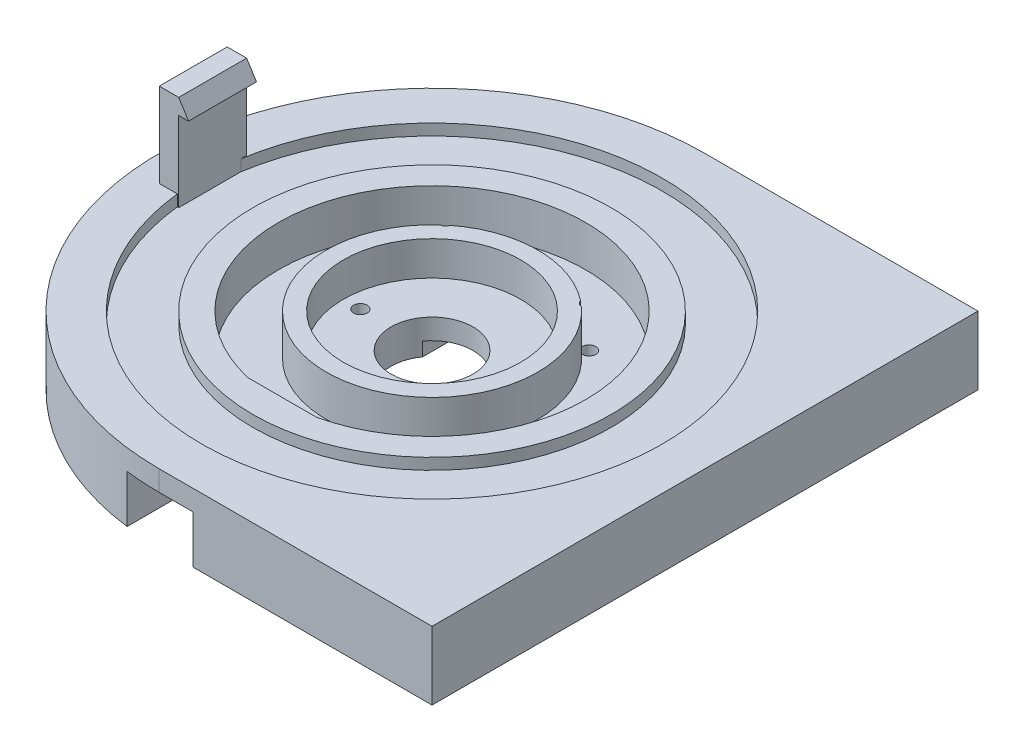
ISO-10303-21;
HEADER;
FILE_DESCRIPTION(('STEP AP214'),'2;1');
FILE_NAME('part.step','',(''),(''),'','','');
FILE_SCHEMA(('AUTOMOTIVE_DESIGN { 1 0 10303 214 1 1 1 1 }'));
ENDSEC;
DATA;
#1=APPLICATION_CONTEXT('core data for automotive mechanical design processes');
#2=APPLICATION_PROTOCOL_DEFINITION('international standard','automotive_design',2000,#1);
#3=PRODUCT_CONTEXT('',#1,'mechanical');
#4=PRODUCT('Part','Part','',(#3));
#5=PRODUCT_RELATED_PRODUCT_CATEGORY('part','',(#4));
#6=PRODUCT_DEFINITION_FORMATION('','',#4);
#7=PRODUCT_DEFINITION_CONTEXT('part definition',#1,'design');
#8=PRODUCT_DEFINITION('design','',#6,#7);
#9=PRODUCT_DEFINITION_SHAPE('','',#8);
#10=(LENGTH_UNIT() NAMED_UNIT(*) SI_UNIT(.MILLI.,.METRE.));
#11=(NAMED_UNIT(*) PLANE_ANGLE_UNIT() SI_UNIT($,.RADIAN.));
#12=(NAMED_UNIT(*) SI_UNIT($,.STERADIAN.) SOLID_ANGLE_UNIT());
#13=UNCERTAINTY_MEASURE_WITH_UNIT(LENGTH_MEASURE(1.E-05),#10,'distance_accuracy_value','');
#14=(GEOMETRIC_REPRESENTATION_CONTEXT(3) GLOBAL_UNCERTAINTY_ASSIGNED_CONTEXT((#13)) GLOBAL_UNIT_ASSIGNED_CONTEXT((#10,
#11,#12)) REPRESENTATION_CONTEXT('',''));
#15=CARTESIAN_POINT('',(0.,0.,0.));
#16=DIRECTION('',(0.,0.,1.));
#17=DIRECTION('',(1.,0.,0.));
#18=AXIS2_PLACEMENT_3D('',#15,#16,#17);
#19=CARTESIAN_POINT('',(0.,10.,0.));
#20=DIRECTION('',(0.,-1.,0.));
#21=DIRECTION('',(0.,0.,-1.));
#22=AXIS2_PLACEMENT_3D('',#19,#20,#21);
#23=PLANE('',#22);
#24=CARTESIAN_POINT('',(1.94458541445556,10.,-4.24128307319286));
#25=DIRECTION('',(0.,1.,0.));
#26=DIRECTION('',(0.,0.,1.));
#27=AXIS2_PLACEMENT_3D('',#24,#25,#26);
#28=CIRCLE('',#27,40.);
#29=CARTESIAN_POINT('',(1.94458541445556,10.,-44.2412830731929));
#30=VERTEX_POINT('',#29);
#31=CARTESIAN_POINT('',(1.94458541445556,10.,35.7587169268071));
#32=VERTEX_POINT('',#31);
#33=EDGE_CURVE('E256',#30,#32,#28,.T.);
#34=ORIENTED_EDGE('',*,*,#33,.T.);
#35=DIRECTION('',(1.,0.,0.));
#36=VECTOR('',#35,1.);
#37=CARTESIAN_POINT('',(-38.0554145855444,10.,35.7587169268071));
#38=LINE('',#37,#36);
#39=CARTESIAN_POINT('',(41.9445854144556,10.,35.7587169268071));
#40=VERTEX_POINT('',#39);
#41=EDGE_CURVE('E388',#32,#40,#38,.T.);
#42=ORIENTED_EDGE('',*,*,#41,.T.);
#43=DIRECTION('',(0.,0.,-1.));
#44=VECTOR('',#43,1.);
#45=CARTESIAN_POINT('',(41.9445854144556,10.,35.7587169268071));
#46=LINE('',#45,#44);
#47=CARTESIAN_POINT('',(41.9445854144556,10.,-44.2412830731929));
#48=VERTEX_POINT('',#47);
#49=EDGE_CURVE('E390',#40,#48,#46,.T.);
#50=ORIENTED_EDGE('',*,*,#49,.T.);
#51=DIRECTION('',(-1.,0.,0.));
#52=VECTOR('',#51,1.);
#53=CARTESIAN_POINT('',(-38.0554145855444,10.,-44.2412830731929));
#54=LINE('',#53,#52);
#55=EDGE_CURVE('E393',#48,#30,#54,.T.);
#56=ORIENTED_EDGE('',*,*,#55,.T.);
#57=EDGE_LOOP('',(#34,#42,#50,#56));
#58=FACE_BOUND('',#57,.T.);
#59=DIRECTION('',(1.,0.,0.));
#60=VECTOR('',#59,1.);
#61=CARTESIAN_POINT('',(0.,10.,-0.452703633644858));
#62=LINE('',#61,#60);
#63=CARTESIAN_POINT('',(-34.2364951699685,10.,-0.452703633644858));
#64=VERTEX_POINT('',#63);
#65=CARTESIAN_POINT('',(-31.5920984679773,10.,-0.452703633644858));
#66=VERTEX_POINT('',#65);
#67=EDGE_CURVE('E248',#64,#66,#62,.T.);
#68=ORIENTED_EDGE('',*,*,#67,.F.);
#69=DIRECTION('',(0.,0.,1.));
#70=VECTOR('',#69,1.);
#71=CARTESIAN_POINT('',(-34.2364951699685,10.,0.));
#72=LINE('',#71,#70);
#73=CARTESIAN_POINT('',(-34.2364951699685,10.,-10.4080430251595));
#74=VERTEX_POINT('',#73);
#75=EDGE_CURVE('E11',#74,#64,#72,.T.);
#76=ORIENTED_EDGE('',*,*,#75,.F.);
#77=DIRECTION('',(-1.,0.,0.));
#78=VECTOR('',#77,1.);
#79=CARTESIAN_POINT('',(0.,10.,-10.4080430251595));
#80=LINE('',#79,#78);
#81=CARTESIAN_POINT('',(-31.3854475420589,10.,-10.4080430251595));
#82=VERTEX_POINT('',#81);
#83=EDGE_CURVE('E41',#82,#74,#80,.T.);
#84=ORIENTED_EDGE('',*,*,#83,.F.);
#85=DIRECTION('',(0.,0.,-1.));
#86=VECTOR('',#85,1.);
#87=CARTESIAN_POINT('',(-31.3854475420589,10.,0.));
#88=LINE('',#87,#86);
#89=CARTESIAN_POINT('',(-31.3854475420589,10.,-9.54895705693214));
#90=VERTEX_POINT('',#89);
#91=EDGE_CURVE('E230',#90,#82,#88,.T.);
#92=ORIENTED_EDGE('',*,*,#91,.F.);
#93=CARTESIAN_POINT('',(1.94458541445557,10.,-4.24128307319287));
#94=DIRECTION('',(0.,1.,0.));
#95=DIRECTION('',(0.,0.,1.));
#96=AXIS2_PLACEMENT_3D('',#93,#94,#95);
#97=CIRCLE('',#96,33.75);
#98=EDGE_CURVE('E306',#66,#90,#97,.T.);
#99=ORIENTED_EDGE('',*,*,#98,.F.);
#100=EDGE_LOOP('',(#68,#76,#84,#92,#99));
#101=FACE_BOUND('',#100,.T.);
#102=ADVANCED_FACE('F33',(#58,#101),#23,.F.);
#103=CARTESIAN_POINT('',(1.94458541445557,8.35,-4.24128307319287));
#104=DIRECTION('',(0.,1.,0.));
#105=DIRECTION('',(0.,0.,1.));
#106=AXIS2_PLACEMENT_3D('',#103,#104,#105);
#107=CYLINDRICAL_SURFACE('',#106,33.75);
#108=DIRECTION('',(0.,1.,0.));
#109=VECTOR('',#108,1.);
#110=CARTESIAN_POINT('',(-31.5920984679773,8.35,-0.452703633644858));
#111=LINE('',#110,#109);
#112=CARTESIAN_POINT('',(-31.5920984679773,8.35,-0.452703633644858));
#113=VERTEX_POINT('',#112);
#114=EDGE_CURVE('E246',#66,#113,#111,.F.);
#115=ORIENTED_EDGE('',*,*,#114,.F.);
#116=ORIENTED_EDGE('',*,*,#98,.T.);
#117=DIRECTION('',(0.,1.,0.));
#118=VECTOR('',#117,1.);
#119=CARTESIAN_POINT('',(-31.3854475420589,8.35,-9.54895705693214));
#120=LINE('',#119,#118);
#121=CARTESIAN_POINT('',(-31.3854475420589,8.35,-9.54895705693214));
#122=VERTEX_POINT('',#121);
#123=EDGE_CURVE('E243',#122,#90,#120,.T.);
#124=ORIENTED_EDGE('',*,*,#123,.F.);
#125=CARTESIAN_POINT('',(1.94458541445557,8.35,-4.24128307319287));
#126=DIRECTION('',(0.,1.,0.));
#127=DIRECTION('',(0.,0.,1.));
#128=AXIS2_PLACEMENT_3D('',#125,#126,#127);
#129=CIRCLE('',#128,33.75);
#130=EDGE_CURVE('E309',#113,#122,#129,.T.);
#131=ORIENTED_EDGE('',*,*,#130,.F.);
#132=EDGE_LOOP('',(#115,#116,#124,#131));
#133=FACE_BOUND('',#132,.T.);
#134=ADVANCED_FACE('F451',(#133),#107,.F.);
#135=CARTESIAN_POINT('',(1.94458541445557,8.35,-4.24128307319287));
#136=DIRECTION('',(0.,1.,0.));
#137=DIRECTION('',(0.,0.,1.));
#138=AXIS2_PLACEMENT_3D('',#135,#136,#137);
#139=PLANE('',#138);
#140=CARTESIAN_POINT('',(1.94458541445557,8.35,-4.24128307319287));
#141=DIRECTION('',(0.,1.,0.));
#142=DIRECTION('',(0.,0.,1.));
#143=AXIS2_PLACEMENT_3D('',#140,#141,#142);
#144=CIRCLE('',#143,26.25);
#145=CARTESIAN_POINT('',(1.94458541445557,8.35,22.0087169268071));
#146=VERTEX_POINT('',#145);
#147=EDGE_CURVE('E303',#146,#146,#144,.T.);
#148=ORIENTED_EDGE('',*,*,#147,.F.);
#149=EDGE_LOOP('',(#148));
#150=FACE_BOUND('',#149,.T.);
#151=DIRECTION('',(0.,0.,-1.));
#152=VECTOR('',#151,1.);
#153=CARTESIAN_POINT('',(-31.3854475420589,8.35,-10.4080430251595));
#154=LINE('',#153,#152);
#155=CARTESIAN_POINT('',(-31.3854475420589,8.35,-0.452703633644858));
#156=VERTEX_POINT('',#155);
#157=EDGE_CURVE('E456',#156,#122,#154,.T.);
#158=ORIENTED_EDGE('',*,*,#157,.F.);
#159=DIRECTION('',(-1.,0.,0.));
#160=VECTOR('',#159,1.);
#161=CARTESIAN_POINT('',(1.94458541445557,8.35,-0.452703633644858));
#162=LINE('',#161,#160);
#163=EDGE_CURVE('E433',#156,#113,#162,.T.);
#164=ORIENTED_EDGE('',*,*,#163,.T.);
#165=ORIENTED_EDGE('',*,*,#130,.T.);
#166=EDGE_LOOP('',(#158,#164,#165));
#167=FACE_BOUND('',#166,.T.);
#168=ADVANCED_FACE('F455',(#150,#167),#139,.T.);
#169=CARTESIAN_POINT('',(0.,0.,0.));
#170=DIRECTION('',(0.,-1.,0.));
#171=DIRECTION('',(0.,0.,-1.));
#172=AXIS2_PLACEMENT_3D('',#169,#170,#171);
#173=PLANE('',#172);
#174=DIRECTION('',(0.,0.,-1.));
#175=VECTOR('',#174,1.);
#176=CARTESIAN_POINT('',(-2.93335983094335,0.,-18.6283350162171));
#177=LINE('',#176,#175);
#178=CARTESIAN_POINT('',(-2.93335983094335,0.,-7.73494164020971));
#179=VERTEX_POINT('',#178);
#180=CARTESIAN_POINT('',(-2.93335983094335,0.,-18.6283350162171));
#181=VERTEX_POINT('',#180);
#182=EDGE_CURVE('E264',#179,#181,#177,.T.);
#183=ORIENTED_EDGE('',*,*,#182,.F.);
#184=CARTESIAN_POINT('',(1.94458541445556,0.,-4.24128307319286));
#185=DIRECTION('',(0.,1.,0.));
#186=DIRECTION('',(0.,0.,1.));
#187=AXIS2_PLACEMENT_3D('',#184,#185,#186);
#188=CIRCLE('',#187,6.);
#189=CARTESIAN_POINT('',(6.86664016905719,0.,-7.67251856390221));
#190=VERTEX_POINT('',#189);
#191=EDGE_CURVE('E384',#179,#190,#188,.T.);
#192=ORIENTED_EDGE('',*,*,#191,.T.);
#193=DIRECTION('',(0.,0.,1.));
#194=VECTOR('',#193,1.);
#195=CARTESIAN_POINT('',(6.86664016905719,0.,-7.59099295485299));
#196=LINE('',#195,#194);
#197=CARTESIAN_POINT('',(6.86664016905719,0.,-18.6283350162171));
#198=VERTEX_POINT('',#197);
#199=EDGE_CURVE('E271',#198,#190,#196,.T.);
#200=ORIENTED_EDGE('',*,*,#199,.F.);
#201=DIRECTION('',(1.,0.,0.));
#202=VECTOR('',#201,1.);
#203=CARTESIAN_POINT('',(6.86664016905719,0.,-18.6283350162171));
#204=LINE('',#203,#202);
#205=EDGE_CURVE('E259',#181,#198,#204,.T.);
#206=ORIENTED_EDGE('',*,*,#205,.F.);
#207=EDGE_LOOP('',(#183,#192,#200,#206));
#208=FACE_BOUND('',#207,.T.);
#209=CARTESIAN_POINT('',(-8.55541458554444,0.,-4.24128307319286));
#210=DIRECTION('',(0.,-1.,0.));
#211=DIRECTION('',(0.,0.,1.));
#212=AXIS2_PLACEMENT_3D('',#209,#210,#211);
#213=CIRCLE('',#212,1.);
#214=CARTESIAN_POINT('',(-8.55541458554444,0.,-3.24128307319286));
#215=VERTEX_POINT('',#214);
#216=EDGE_CURVE('E277',#215,#215,#213,.T.);
#217=ORIENTED_EDGE('',*,*,#216,.F.);
#218=EDGE_LOOP('',(#217));
#219=FACE_BOUND('',#218,.T.);
#220=CARTESIAN_POINT('',(-8.55541458554444,0.,-16.7412830731929));
#221=DIRECTION('',(0.,-1.,0.));
#222=DIRECTION('',(0.,0.,1.));
#223=AXIS2_PLACEMENT_3D('',#220,#221,#222);
#224=CIRCLE('',#223,1.);
#225=CARTESIAN_POINT('',(-8.55541458554444,0.,-15.7412830731929));
#226=VERTEX_POINT('',#225);
#227=EDGE_CURVE('E286',#226,#226,#224,.T.);
#228=ORIENTED_EDGE('',*,*,#227,.F.);
#229=EDGE_LOOP('',(#228));
#230=FACE_BOUND('',#229,.T.);
#231=CARTESIAN_POINT('',(12.4445854144556,0.,-4.24128307319286));
#232=DIRECTION('',(0.,-1.,0.));
#233=DIRECTION('',(0.,0.,-1.));
#234=AXIS2_PLACEMENT_3D('',#231,#232,#233);
#235=CIRCLE('',#234,1.);
#236=CARTESIAN_POINT('',(12.4445854144556,0.,-5.24128307319286));
#237=VERTEX_POINT('',#236);
#238=EDGE_CURVE('E290',#237,#237,#235,.T.);
#239=ORIENTED_EDGE('',*,*,#238,.F.);
#240=EDGE_LOOP('',(#239));
#241=FACE_BOUND('',#240,.T.);
#242=CARTESIAN_POINT('',(12.4445854144556,0.,-16.7412830731929));
#243=DIRECTION('',(0.,-1.,0.));
#244=DIRECTION('',(0.,0.,-1.));
#245=AXIS2_PLACEMENT_3D('',#242,#243,#244);
#246=CIRCLE('',#245,1.);
#247=CARTESIAN_POINT('',(12.4445854144556,0.,-17.7412830731929));
#248=VERTEX_POINT('',#247);
#249=EDGE_CURVE('E298',#248,#248,#246,.T.);
#250=ORIENTED_EDGE('',*,*,#249,.F.);
#251=EDGE_LOOP('',(#250));
#252=FACE_BOUND('',#251,.T.);
#253=DIRECTION('',(0.,0.,-1.));
#254=VECTOR('',#253,1.);
#255=CARTESIAN_POINT('',(-3.05541458554445,0.,0.));
#256=LINE('',#255,#254);
#257=CARTESIAN_POINT('',(-3.05541458554445,0.,35.444986592776));
#258=VERTEX_POINT('',#257);
#259=CARTESIAN_POINT('',(-3.05541458554445,0.,26.7274224110473));
#260=VERTEX_POINT('',#259);
#261=EDGE_CURVE('E326',#258,#260,#256,.T.);
#262=ORIENTED_EDGE('',*,*,#261,.F.);
#263=CARTESIAN_POINT('',(1.94458541445556,0.,-4.24128307319286));
#264=DIRECTION('',(0.,-1.,0.));
#265=DIRECTION('',(0.,0.,-1.));
#266=AXIS2_PLACEMENT_3D('',#263,#264,#265);
#267=CIRCLE('',#266,40.);
#268=CARTESIAN_POINT('',(1.94458541445556,0.,-44.2412830731929));
#269=VERTEX_POINT('',#268);
#270=EDGE_CURVE('E429',#258,#269,#267,.T.);
#271=ORIENTED_EDGE('',*,*,#270,.T.);
#272=DIRECTION('',(-1.,0.,0.));
#273=VECTOR('',#272,1.);
#274=CARTESIAN_POINT('',(-38.0554145855444,0.,-44.2412830731929));
#275=LINE('',#274,#273);
#276=CARTESIAN_POINT('',(41.9445854144556,0.,-44.2412830731929));
#277=VERTEX_POINT('',#276);
#278=EDGE_CURVE('E391',#277,#269,#275,.T.);
#279=ORIENTED_EDGE('',*,*,#278,.F.);
#280=DIRECTION('',(0.,0.,-1.));
#281=VECTOR('',#280,1.);
#282=CARTESIAN_POINT('',(41.9445854144556,0.,35.7587169268071));
#283=LINE('',#282,#281);
#284=CARTESIAN_POINT('',(41.9445854144556,0.,35.7587169268071));
#285=VERTEX_POINT('',#284);
#286=EDGE_CURVE('E398',#285,#277,#283,.T.);
#287=ORIENTED_EDGE('',*,*,#286,.F.);
#288=DIRECTION('',(1.,0.,0.));
#289=VECTOR('',#288,1.);
#290=CARTESIAN_POINT('',(-38.0554145855444,0.,35.7587169268071));
#291=LINE('',#290,#289);
#292=CARTESIAN_POINT('',(6.94458541445556,0.,35.7587169268071));
#293=VERTEX_POINT('',#292);
#294=EDGE_CURVE('E387',#293,#285,#291,.T.);
#295=ORIENTED_EDGE('',*,*,#294,.F.);
#296=DIRECTION('',(0.,0.,1.));
#297=VECTOR('',#296,1.);
#298=CARTESIAN_POINT('',(6.94458541445556,0.,0.));
#299=LINE('',#298,#297);
#300=CARTESIAN_POINT('',(6.94458541445556,0.,26.7274224110473));
#301=VERTEX_POINT('',#300);
#302=EDGE_CURVE('E320',#301,#293,#299,.T.);
#303=ORIENTED_EDGE('',*,*,#302,.F.);
#304=DIRECTION('',(1.,0.,0.));
#305=VECTOR('',#304,1.);
#306=CARTESIAN_POINT('',(0.,0.,26.7274224110473));
#307=LINE('',#306,#305);
#308=EDGE_CURVE('E324',#260,#301,#307,.T.);
#309=ORIENTED_EDGE('',*,*,#308,.F.);
#310=EDGE_LOOP('',(#262,#271,#279,#287,#295,#303,#309));
#311=FACE_BOUND('',#310,.T.);
#312=ADVANCED_FACE('F542',(#208,#219,#230,#241,#252,#311),#173,.T.);
#313=CARTESIAN_POINT('',(-3.05541458554445,4.,0.));
#314=DIRECTION('',(1.,0.,0.));
#315=DIRECTION('',(0.,0.,-1.));
#316=AXIS2_PLACEMENT_3D('',#313,#314,#315);
#317=PLANE('',#316);
#318=DIRECTION('',(0.,0.,-1.));
#319=VECTOR('',#318,1.);
#320=CARTESIAN_POINT('',(-3.05541458554445,7.,35.7587169268071));
#321=LINE('',#320,#319);
#322=CARTESIAN_POINT('',(-3.05541458554444,7.,35.444986592776));
#323=VERTEX_POINT('',#322);
#324=CARTESIAN_POINT('',(-3.05541458554445,7.,17.6961278952874));
#325=VERTEX_POINT('',#324);
#326=EDGE_CURVE('E328',#323,#325,#321,.T.);
#327=ORIENTED_EDGE('',*,*,#326,.F.);
#328=DIRECTION('',(0.,1.,0.));
#329=VECTOR('',#328,1.);
#330=CARTESIAN_POINT('',(-3.05541458554445,-10.,35.444986592776));
#331=LINE('',#330,#329);
#332=EDGE_CURVE('E253',#323,#258,#331,.F.);
#333=ORIENTED_EDGE('',*,*,#332,.T.);
#334=ORIENTED_EDGE('',*,*,#261,.T.);
#335=DIRECTION('',(0.,1.,0.));
#336=VECTOR('',#335,1.);
#337=CARTESIAN_POINT('',(-3.05541458554445,-6.,26.7274224110473));
#338=LINE('',#337,#336);
#339=CARTESIAN_POINT('',(-3.05541458554445,4.,26.7274224110473));
#340=VERTEX_POINT('',#339);
#341=EDGE_CURVE('E318',#260,#340,#338,.T.);
#342=ORIENTED_EDGE('',*,*,#341,.T.);
#343=DIRECTION('',(0.,0.,-1.));
#344=VECTOR('',#343,1.);
#345=CARTESIAN_POINT('',(-3.05541458554445,4.,0.));
#346=LINE('',#345,#344);
#347=CARTESIAN_POINT('',(-3.05541458554445,4.,17.6961278952874));
#348=VERTEX_POINT('',#347);
#349=EDGE_CURVE('E350',#340,#348,#346,.T.);
#350=ORIENTED_EDGE('',*,*,#349,.T.);
#351=DIRECTION('',(0.,1.,0.));
#352=VECTOR('',#351,1.);
#353=CARTESIAN_POINT('',(-3.05541458554445,4.,17.6961278952874));
#354=LINE('',#353,#352);
#355=EDGE_CURVE('E357',#348,#325,#354,.T.);
#356=ORIENTED_EDGE('',*,*,#355,.T.);
#357=EDGE_LOOP('',(#327,#333,#334,#342,#350,#356));
#358=FACE_BOUND('',#357,.T.);
#359=ADVANCED_FACE('F545',(#358),#317,.T.);
#360=CARTESIAN_POINT('',(-38.0554145855444,10.,35.7587169268071));
#361=DIRECTION('',(0.,0.,-1.));
#362=DIRECTION('',(-1.,0.,0.));
#363=AXIS2_PLACEMENT_3D('',#360,#361,#362);
#364=PLANE('',#363);
#365=DIRECTION('',(0.,1.,0.));
#366=VECTOR('',#365,1.);
#367=CARTESIAN_POINT('',(1.94458541445556,-10.,35.7587169268071));
#368=LINE('',#367,#366);
#369=CARTESIAN_POINT('',(1.94458541445556,7.,35.7587169268071));
#370=VERTEX_POINT('',#369);
#371=EDGE_CURVE('E250',#370,#32,#368,.T.);
#372=ORIENTED_EDGE('',*,*,#371,.F.);
#373=DIRECTION('',(-1.,0.,0.));
#374=VECTOR('',#373,1.);
#375=CARTESIAN_POINT('',(9.94458541445556,7.,35.7587169268071));
#376=LINE('',#375,#374);
#377=CARTESIAN_POINT('',(6.94458541445556,7.,35.7587169268071));
#378=VERTEX_POINT('',#377);
#379=EDGE_CURVE('E338',#378,#370,#376,.T.);
#380=ORIENTED_EDGE('',*,*,#379,.F.);
#381=DIRECTION('',(0.,1.,0.));
#382=VECTOR('',#381,1.);
#383=CARTESIAN_POINT('',(6.94458541445556,4.,35.7587169268071));
#384=LINE('',#383,#382);
#385=EDGE_CURVE('E353',#293,#378,#384,.T.);
#386=ORIENTED_EDGE('',*,*,#385,.F.);
#387=ORIENTED_EDGE('',*,*,#294,.T.);
#388=DIRECTION('',(0.,-1.,0.));
#389=VECTOR('',#388,1.);
#390=CARTESIAN_POINT('',(41.9445854144556,10.,35.7587169268071));
#391=LINE('',#390,#389);
#392=EDGE_CURVE('E404',#40,#285,#391,.T.);
#393=ORIENTED_EDGE('',*,*,#392,.F.);
#394=ORIENTED_EDGE('',*,*,#41,.F.);
#395=EDGE_LOOP('',(#372,#380,#386,#387,#393,#394));
#396=FACE_BOUND('',#395,.T.);
#397=ADVANCED_FACE('F35',(#396),#364,.F.);
#398=CARTESIAN_POINT('',(9.94458541445556,7.,35.7587169268071));
#399=DIRECTION('',(0.,1.,0.));
#400=DIRECTION('',(0.,0.,1.));
#401=AXIS2_PLACEMENT_3D('',#398,#399,#400);
#402=PLANE('',#401);
#403=CARTESIAN_POINT('',(1.94458541445556,7.,-4.24128307319286));
#404=DIRECTION('',(0.,1.,0.));
#405=DIRECTION('',(0.,0.,1.));
#406=AXIS2_PLACEMENT_3D('',#403,#404,#405);
#407=CIRCLE('',#406,40.);
#408=EDGE_CURVE('E431',#323,#370,#407,.T.);
#409=ORIENTED_EDGE('',*,*,#408,.F.);
#410=ORIENTED_EDGE('',*,*,#326,.T.);
#411=DIRECTION('',(-1.,0.,0.));
#412=VECTOR('',#411,1.);
#413=CARTESIAN_POINT('',(9.94458541445556,7.,17.6961278952874));
#414=LINE('',#413,#412);
#415=CARTESIAN_POINT('',(6.94458541445557,7.,17.6961278952874));
#416=VERTEX_POINT('',#415);
#417=EDGE_CURVE('E335',#416,#325,#414,.T.);
#418=ORIENTED_EDGE('',*,*,#417,.F.);
#419=DIRECTION('',(0.,0.,-1.));
#420=VECTOR('',#419,1.);
#421=CARTESIAN_POINT('',(6.94458541445559,7.,0.));
#422=LINE('',#421,#420);
#423=EDGE_CURVE('E344',#378,#416,#422,.T.);
#424=ORIENTED_EDGE('',*,*,#423,.F.);
#425=ORIENTED_EDGE('',*,*,#379,.T.);
#426=EDGE_LOOP('',(#409,#410,#418,#424,#425));
#427=FACE_BOUND('',#426,.T.);
#428=ADVANCED_FACE('F583',(#427),#402,.F.);
#429=CARTESIAN_POINT('',(1.94458541445556,4.,-4.24128307319286));
#430=DIRECTION('',(0.,1.,0.));
#431=DIRECTION('',(0.,0.,1.));
#432=AXIS2_PLACEMENT_3D('',#429,#430,#431);
#433=CYLINDRICAL_SURFACE('',#432,15.5);
#434=DIRECTION('',(0.,-1.,0.));
#435=VECTOR('',#434,1.);
#436=CARTESIAN_POINT('',(-8.44036693574198,5.,-15.7479230990269));
#437=LINE('',#436,#435);
#438=CARTESIAN_POINT('',(-8.44036693574198,4.,-15.7479230990269));
#439=VERTEX_POINT('',#438);
#440=CARTESIAN_POINT('',(-8.44036693574197,10.,-15.7479230990269));
#441=VERTEX_POINT('',#440);
#442=EDGE_CURVE('E416',#439,#441,#437,.F.);
#443=ORIENTED_EDGE('',*,*,#442,.F.);
#444=CARTESIAN_POINT('',(1.94458541445556,4.,-4.24128307319286));
#445=DIRECTION('',(0.,1.,0.));
#446=DIRECTION('',(0.,0.,1.));
#447=AXIS2_PLACEMENT_3D('',#444,#445,#446);
#448=CIRCLE('',#447,15.5);
#449=CARTESIAN_POINT('',(12.3295377646531,4.,-15.7479230990269));
#450=VERTEX_POINT('',#449);
#451=EDGE_CURVE('E366',#439,#450,#448,.T.);
#452=ORIENTED_EDGE('',*,*,#451,.T.);
#453=DIRECTION('',(0.,-1.,0.));
#454=VECTOR('',#453,1.);
#455=CARTESIAN_POINT('',(12.3295377646531,5.,-15.7479230990269));
#456=LINE('',#455,#454);
#457=CARTESIAN_POINT('',(12.3295377646531,10.,-15.7479230990269));
#458=VERTEX_POINT('',#457);
#459=EDGE_CURVE('E407',#458,#450,#456,.T.);
#460=ORIENTED_EDGE('',*,*,#459,.F.);
#461=CARTESIAN_POINT('',(1.94458541445556,10.,-4.24128307319286));
#462=DIRECTION('',(0.,1.,0.));
#463=DIRECTION('',(0.,0.,1.));
#464=AXIS2_PLACEMENT_3D('',#461,#462,#463);
#465=CIRCLE('',#464,15.5);
#466=EDGE_CURVE('E356',#441,#458,#465,.T.);
#467=ORIENTED_EDGE('',*,*,#466,.F.);
#468=EDGE_LOOP('',(#443,#452,#460,#467));
#469=FACE_BOUND('',#468,.T.);
#470=ADVANCED_FACE('F497',(#469),#433,.T.);
#471=CARTESIAN_POINT('',(1.94458541445556,10.,-4.24128307319286));
#472=DIRECTION('',(0.,1.,0.));
#473=DIRECTION('',(0.,0.,1.));
#474=AXIS2_PLACEMENT_3D('',#471,#472,#473);
#475=CIRCLE('',#474,22.5);
#476=CARTESIAN_POINT('',(6.94458541445556,10.,17.6961278952874));
#477=VERTEX_POINT('',#476);
#478=CARTESIAN_POINT('',(-3.05541458554445,10.,17.6961278952874));
#479=VERTEX_POINT('',#478);
#480=EDGE_CURVE('E365',#477,#479,#475,.T.);
#481=ORIENTED_EDGE('',*,*,#480,.F.);
#482=DIRECTION('',(-1.,0.,0.));
#483=VECTOR('',#482,1.);
#484=CARTESIAN_POINT('',(9.94458541445556,10.,17.6961278952874));
#485=LINE('',#484,#483);
#486=EDGE_CURVE('E332',#477,#479,#485,.T.);
#487=ORIENTED_EDGE('',*,*,#486,.T.);
#488=EDGE_LOOP('',(#481,#487));
#489=FACE_BOUND('',#488,.T.);
#490=CARTESIAN_POINT('',(1.94458541445557,10.,-4.24128307319287));
#491=DIRECTION('',(0.,1.,0.));
#492=DIRECTION('',(0.,0.,1.));
#493=AXIS2_PLACEMENT_3D('',#490,#491,#492);
#494=CIRCLE('',#493,26.25);
#495=CARTESIAN_POINT('',(1.94458541445557,10.,22.0087169268071));
#496=VERTEX_POINT('',#495);
#497=EDGE_CURVE('E302',#496,#496,#494,.T.);
#498=ORIENTED_EDGE('',*,*,#497,.T.);
#499=EDGE_LOOP('',(#498));
#500=FACE_BOUND('',#499,.T.);
#501=ADVANCED_FACE('F487',(#489,#500),#23,.F.);
#502=CARTESIAN_POINT('',(6.94458541445559,4.,0.));
#503=DIRECTION('',(-1.,0.,0.));
#504=DIRECTION('',(0.,0.,1.));
#505=AXIS2_PLACEMENT_3D('',#502,#503,#504);
#506=PLANE('',#505);
#507=ORIENTED_EDGE('',*,*,#385,.T.);
#508=ORIENTED_EDGE('',*,*,#423,.T.);
#509=DIRECTION('',(0.,1.,0.));
#510=VECTOR('',#509,1.);
#511=CARTESIAN_POINT('',(6.94458541445557,4.,17.6961278952874));
#512=LINE('',#511,#510);
#513=CARTESIAN_POINT('',(6.94458541445557,4.,17.6961278952874));
#514=VERTEX_POINT('',#513);
#515=EDGE_CURVE('E352',#514,#416,#512,.T.);
#516=ORIENTED_EDGE('',*,*,#515,.F.);
#517=DIRECTION('',(0.,0.,1.));
#518=VECTOR('',#517,1.);
#519=CARTESIAN_POINT('',(6.94458541445559,4.,0.));
#520=LINE('',#519,#518);
#521=CARTESIAN_POINT('',(6.94458541445556,4.,26.7274224110473));
#522=VERTEX_POINT('',#521);
#523=EDGE_CURVE('E347',#514,#522,#520,.T.);
#524=ORIENTED_EDGE('',*,*,#523,.T.);
#525=DIRECTION('',(0.,1.,0.));
#526=VECTOR('',#525,1.);
#527=CARTESIAN_POINT('',(6.94458541445556,-6.,26.7274224110473));
#528=LINE('',#527,#526);
#529=EDGE_CURVE('E317',#301,#522,#528,.T.);
#530=ORIENTED_EDGE('',*,*,#529,.F.);
#531=ORIENTED_EDGE('',*,*,#302,.T.);
#532=EDGE_LOOP('',(#507,#508,#516,#524,#530,#531));
#533=FACE_BOUND('',#532,.T.);
#534=ADVANCED_FACE('F496',(#533),#506,.T.);
#535=CARTESIAN_POINT('',(1.94458541445556,4.,-4.24128307319286));
#536=DIRECTION('',(0.,1.,0.));
#537=DIRECTION('',(0.,0.,1.));
#538=AXIS2_PLACEMENT_3D('',#535,#536,#537);
#539=CYLINDRICAL_SURFACE('',#538,22.5);
#540=ORIENTED_EDGE('',*,*,#515,.T.);
#541=DIRECTION('',(0.,1.,0.));
#542=VECTOR('',#541,1.);
#543=CARTESIAN_POINT('',(6.94458541445557,4.,17.6961278952874));
#544=LINE('',#543,#542);
#545=EDGE_CURVE('E341',#416,#477,#544,.T.);
#546=ORIENTED_EDGE('',*,*,#545,.T.);
#547=ORIENTED_EDGE('',*,*,#480,.T.);
#548=DIRECTION('',(0.,1.,0.));
#549=VECTOR('',#548,1.);
#550=CARTESIAN_POINT('',(-3.05541458554445,7.,17.6961278952874));
#551=LINE('',#550,#549);
#552=EDGE_CURVE('E330',#325,#479,#551,.T.);
#553=ORIENTED_EDGE('',*,*,#552,.F.);
#554=ORIENTED_EDGE('',*,*,#355,.F.);
#555=CARTESIAN_POINT('',(1.94458541445556,4.,-4.24128307319286));
#556=DIRECTION('',(0.,1.,0.));
#557=DIRECTION('',(0.,0.,1.));
#558=AXIS2_PLACEMENT_3D('',#555,#556,#557);
#559=CIRCLE('',#558,22.5);
#560=EDGE_CURVE('E370',#514,#348,#559,.T.);
#561=ORIENTED_EDGE('',*,*,#560,.F.);
#562=EDGE_LOOP('',(#540,#546,#547,#553,#554,#561));
#563=FACE_BOUND('',#562,.T.);
#564=ADVANCED_FACE('F501',(#563),#539,.F.);
#565=CARTESIAN_POINT('',(1.94458541445556,10.,-4.24128307319286));
#566=DIRECTION('',(0.,1.,0.));
#567=DIRECTION('',(0.,0.,1.));
#568=AXIS2_PLACEMENT_3D('',#565,#566,#567);
#569=CIRCLE('',#568,13.);
#570=CARTESIAN_POINT('',(1.94458541445556,10.,8.75871692680714));
#571=VERTEX_POINT('',#570);
#572=EDGE_CURVE('E373',#571,#571,#569,.T.);
#573=ORIENTED_EDGE('',*,*,#572,.F.);
#574=EDGE_LOOP('',(#573));
#575=FACE_BOUND('',#574,.T.);
#576=CARTESIAN_POINT('',(11.4859932893987,10.,-16.4565004582406));
#577=VERTEX_POINT('',#576);
#578=CARTESIAN_POINT('',(-7.59682246048762,10.,-16.4565004582406));
#579=VERTEX_POINT('',#578);
#580=EDGE_CURVE('E367',#577,#579,#465,.T.);
#581=ORIENTED_EDGE('',*,*,#580,.T.);
#582=CARTESIAN_POINT('',(-8.55541458554444,10.,-16.7412830731929));
#583=DIRECTION('',(0.,-1.,0.));
#584=DIRECTION('',(0.,0.,1.));
#585=AXIS2_PLACEMENT_3D('',#582,#583,#584);
#586=CIRCLE('',#585,1.);
#587=EDGE_CURVE('E282',#579,#441,#586,.T.);
#588=ORIENTED_EDGE('',*,*,#587,.T.);
#589=ORIENTED_EDGE('',*,*,#466,.T.);
#590=CARTESIAN_POINT('',(12.4445854144556,10.,-16.7412830731929));
#591=DIRECTION('',(0.,-1.,0.));
#592=DIRECTION('',(0.,0.,-1.));
#593=AXIS2_PLACEMENT_3D('',#590,#591,#592);
#594=CIRCLE('',#593,1.);
#595=EDGE_CURVE('E294',#458,#577,#594,.T.);
#596=ORIENTED_EDGE('',*,*,#595,.T.);
#597=EDGE_LOOP('',(#581,#588,#589,#596));
#598=FACE_BOUND('',#597,.T.);
#599=ADVANCED_FACE('F488',(#575,#598),#23,.F.);
#600=CARTESIAN_POINT('',(41.9445854144556,10.,35.7587169268071));
#601=DIRECTION('',(-1.,0.,0.));
#602=DIRECTION('',(0.,0.,1.));
#603=AXIS2_PLACEMENT_3D('',#600,#601,#602);
#604=PLANE('',#603);
#605=ORIENTED_EDGE('',*,*,#286,.T.);
#606=DIRECTION('',(0.,-1.,0.));
#607=VECTOR('',#606,1.);
#608=CARTESIAN_POINT('',(41.9445854144556,10.,-44.2412830731929));
#609=LINE('',#608,#607);
#610=EDGE_CURVE('E396',#48,#277,#609,.T.);
#611=ORIENTED_EDGE('',*,*,#610,.F.);
#612=ORIENTED_EDGE('',*,*,#49,.F.);
#613=ORIENTED_EDGE('',*,*,#392,.T.);
#614=EDGE_LOOP('',(#605,#611,#612,#613));
#615=FACE_BOUND('',#614,.T.);
#616=ADVANCED_FACE('F500',(#615),#604,.F.);
#617=CARTESIAN_POINT('',(-38.0554145855444,10.,-44.2412830731929));
#618=DIRECTION('',(0.,0.,1.));
#619=DIRECTION('',(1.,0.,0.));
#620=AXIS2_PLACEMENT_3D('',#617,#618,#619);
#621=PLANE('',#620);
#622=ORIENTED_EDGE('',*,*,#278,.T.);
#623=DIRECTION('',(0.,1.,0.));
#624=VECTOR('',#623,1.);
#625=CARTESIAN_POINT('',(1.94458541445556,-10.,-44.2412830731929));
#626=LINE('',#625,#624);
#627=EDGE_CURVE('E56',#269,#30,#626,.T.);
#628=ORIENTED_EDGE('',*,*,#627,.T.);
#629=ORIENTED_EDGE('',*,*,#55,.F.);
#630=ORIENTED_EDGE('',*,*,#610,.T.);
#631=EDGE_LOOP('',(#622,#628,#629,#630));
#632=FACE_BOUND('',#631,.T.);
#633=ADVANCED_FACE('F507',(#632),#621,.F.);
#634=CARTESIAN_POINT('',(1.94458541445556,10.,-4.24128307319286));
#635=DIRECTION('',(0.,1.,0.));
#636=DIRECTION('',(0.,0.,1.));
#637=AXIS2_PLACEMENT_3D('',#634,#635,#636);
#638=CYLINDRICAL_SURFACE('',#637,6.);
#639=ORIENTED_EDGE('',*,*,#191,.F.);
#640=DIRECTION('',(0.,1.,0.));
#641=VECTOR('',#640,1.);
#642=CARTESIAN_POINT('',(-2.93335983094335,10.,-7.73494164020971));
#643=LINE('',#642,#641);
#644=CARTESIAN_POINT('',(-2.93335983094335,2.,-7.73494164020971));
#645=VERTEX_POINT('',#644);
#646=EDGE_CURVE('E426',#179,#645,#643,.T.);
#647=ORIENTED_EDGE('',*,*,#646,.T.);
#648=CARTESIAN_POINT('',(1.94458541445556,2.,-4.24128307319286));
#649=DIRECTION('',(0.,1.,0.));
#650=DIRECTION('',(0.,0.,1.));
#651=AXIS2_PLACEMENT_3D('',#648,#649,#650);
#652=CIRCLE('',#651,6.);
#653=CARTESIAN_POINT('',(6.86664016905719,2.,-7.67251856390221));
#654=VERTEX_POINT('',#653);
#655=EDGE_CURVE('E418',#645,#654,#652,.F.);
#656=ORIENTED_EDGE('',*,*,#655,.T.);
#657=DIRECTION('',(0.,1.,0.));
#658=VECTOR('',#657,1.);
#659=CARTESIAN_POINT('',(6.86664016905719,10.,-7.67251856390221));
#660=LINE('',#659,#658);
#661=EDGE_CURVE('E423',#654,#190,#660,.F.);
#662=ORIENTED_EDGE('',*,*,#661,.T.);
#663=EDGE_LOOP('',(#639,#647,#656,#662));
#664=FACE_BOUND('',#663,.T.);
#665=CARTESIAN_POINT('',(1.94458541445556,5.,-4.24128307319286));
#666=DIRECTION('',(0.,1.,0.));
#667=DIRECTION('',(0.,0.,1.));
#668=AXIS2_PLACEMENT_3D('',#665,#666,#667);
#669=CIRCLE('',#668,6.);
#670=CARTESIAN_POINT('',(1.94458541445556,5.,1.75871692680714));
#671=VERTEX_POINT('',#670);
#672=EDGE_CURVE('E381',#671,#671,#669,.T.);
#673=ORIENTED_EDGE('',*,*,#672,.T.);
#674=EDGE_LOOP('',(#673));
#675=FACE_BOUND('',#674,.T.);
#676=ADVANCED_FACE('F602',(#664,#675),#638,.F.);
#677=CARTESIAN_POINT('',(7.94458541445556,5.,-4.24128307319286));
#678=DIRECTION('',(0.,-1.,0.));
#679=DIRECTION('',(0.,0.,-1.));
#680=AXIS2_PLACEMENT_3D('',#677,#678,#679);
#681=PLANE('',#680);
#682=CARTESIAN_POINT('',(-8.55541458554444,5.,-4.24128307319286));
#683=DIRECTION('',(0.,-1.,0.));
#684=DIRECTION('',(0.,0.,-1.));
#685=AXIS2_PLACEMENT_3D('',#682,#683,#684);
#686=CIRCLE('',#685,1.);
#687=CARTESIAN_POINT('',(-8.55541458554444,5.,-5.24128307319286));
#688=VERTEX_POINT('',#687);
#689=EDGE_CURVE('E281',#688,#688,#686,.T.);
#690=ORIENTED_EDGE('',*,*,#689,.T.);
#691=EDGE_LOOP('',(#690));
#692=FACE_BOUND('',#691,.T.);
#693=CARTESIAN_POINT('',(12.4445854144556,5.,-4.24128307319286));
#694=DIRECTION('',(0.,-1.,0.));
#695=DIRECTION('',(0.,0.,-1.));
#696=AXIS2_PLACEMENT_3D('',#693,#694,#695);
#697=CIRCLE('',#696,1.);
#698=CARTESIAN_POINT('',(12.4445854144556,5.,-5.24128307319286));
#699=VERTEX_POINT('',#698);
#700=EDGE_CURVE('E293',#699,#699,#697,.T.);
#701=ORIENTED_EDGE('',*,*,#700,.T.);
#702=EDGE_LOOP('',(#701));
#703=FACE_BOUND('',#702,.T.);
#704=ORIENTED_EDGE('',*,*,#672,.F.);
#705=EDGE_LOOP('',(#704));
#706=FACE_BOUND('',#705,.T.);
#707=CARTESIAN_POINT('',(1.94458541445556,5.,-4.24128307319286));
#708=DIRECTION('',(0.,1.,0.));
#709=DIRECTION('',(0.,0.,1.));
#710=AXIS2_PLACEMENT_3D('',#707,#708,#709);
#711=CIRCLE('',#710,13.);
#712=CARTESIAN_POINT('',(1.94458541445556,5.,8.75871692680714));
#713=VERTEX_POINT('',#712);
#714=EDGE_CURVE('E378',#713,#713,#711,.T.);
#715=ORIENTED_EDGE('',*,*,#714,.T.);
#716=EDGE_LOOP('',(#715));
#717=FACE_BOUND('',#716,.T.);
#718=ADVANCED_FACE('F599',(#692,#703,#706,#717),#681,.F.);
#719=CARTESIAN_POINT('',(1.94458541445556,10.,-4.24128307319286));
#720=DIRECTION('',(0.,1.,0.));
#721=DIRECTION('',(0.,0.,1.));
#722=AXIS2_PLACEMENT_3D('',#719,#720,#721);
#723=CYLINDRICAL_SURFACE('',#722,13.);
#724=ORIENTED_EDGE('',*,*,#714,.F.);
#725=EDGE_LOOP('',(#724));
#726=FACE_BOUND('',#725,.T.);
#727=ORIENTED_EDGE('',*,*,#572,.T.);
#728=EDGE_LOOP('',(#727));
#729=FACE_BOUND('',#728,.T.);
#730=ADVANCED_FACE('F595',(#726,#729),#723,.F.);
#731=CARTESIAN_POINT('',(1.94458541445556,4.,-4.24128307319286));
#732=DIRECTION('',(0.,1.,0.));
#733=DIRECTION('',(0.,0.,1.));
#734=AXIS2_PLACEMENT_3D('',#731,#732,#733);
#735=PLANE('',#734);
#736=CARTESIAN_POINT('',(-8.55541458554444,4.,-16.7412830731929));
#737=DIRECTION('',(0.,1.,0.));
#738=DIRECTION('',(0.,0.,1.));
#739=AXIS2_PLACEMENT_3D('',#736,#737,#738);
#740=CIRCLE('',#739,1.);
#741=CARTESIAN_POINT('',(-7.59682246048762,4.,-16.4565004582406));
#742=VERTEX_POINT('',#741);
#743=EDGE_CURVE('E285',#742,#439,#740,.T.);
#744=ORIENTED_EDGE('',*,*,#743,.F.);
#745=CARTESIAN_POINT('',(11.4859932893987,4.,-16.4565004582406));
#746=VERTEX_POINT('',#745);
#747=EDGE_CURVE('E362',#746,#742,#448,.T.);
#748=ORIENTED_EDGE('',*,*,#747,.F.);
#749=CARTESIAN_POINT('',(12.4445854144556,4.,-16.7412830731929));
#750=DIRECTION('',(0.,1.,0.));
#751=DIRECTION('',(0.,0.,1.));
#752=AXIS2_PLACEMENT_3D('',#749,#750,#751);
#753=CIRCLE('',#752,1.);
#754=EDGE_CURVE('E297',#450,#746,#753,.T.);
#755=ORIENTED_EDGE('',*,*,#754,.F.);
#756=ORIENTED_EDGE('',*,*,#451,.F.);
#757=EDGE_LOOP('',(#744,#748,#755,#756));
#758=FACE_BOUND('',#757,.T.);
#759=DIRECTION('',(-1.,0.,0.));
#760=VECTOR('',#759,1.);
#761=CARTESIAN_POINT('',(-3.05541458554445,4.,26.7274224110473));
#762=LINE('',#761,#760);
#763=EDGE_CURVE('E312',#522,#340,#762,.T.);
#764=ORIENTED_EDGE('',*,*,#763,.F.);
#765=ORIENTED_EDGE('',*,*,#523,.F.);
#766=ORIENTED_EDGE('',*,*,#560,.T.);
#767=ORIENTED_EDGE('',*,*,#349,.F.);
#768=EDGE_LOOP('',(#764,#765,#766,#767));
#769=FACE_BOUND('',#768,.T.);
#770=ADVANCED_FACE('F528',(#758,#769),#735,.T.);
#771=DIRECTION('',(0.,-1.,0.));
#772=VECTOR('',#771,1.);
#773=CARTESIAN_POINT('',(-7.59682246048762,5.,-16.4565004582406));
#774=LINE('',#773,#772);
#775=EDGE_CURVE('E412',#579,#742,#774,.T.);
#776=ORIENTED_EDGE('',*,*,#775,.F.);
#777=ORIENTED_EDGE('',*,*,#580,.F.);
#778=DIRECTION('',(0.,-1.,0.));
#779=VECTOR('',#778,1.);
#780=CARTESIAN_POINT('',(11.4859932893987,5.,-16.4565004582406));
#781=LINE('',#780,#779);
#782=EDGE_CURVE('E410',#746,#577,#781,.F.);
#783=ORIENTED_EDGE('',*,*,#782,.F.);
#784=ORIENTED_EDGE('',*,*,#747,.T.);
#785=EDGE_LOOP('',(#776,#777,#783,#784));
#786=FACE_BOUND('',#785,.T.);
#787=ADVANCED_FACE('F519',(#786),#433,.T.);
#788=CARTESIAN_POINT('',(9.94458541445556,7.,17.6961278952874));
#789=DIRECTION('',(0.,0.,1.));
#790=DIRECTION('',(1.,0.,0.));
#791=AXIS2_PLACEMENT_3D('',#788,#789,#790);
#792=PLANE('',#791);
#793=ORIENTED_EDGE('',*,*,#545,.F.);
#794=ORIENTED_EDGE('',*,*,#417,.T.);
#795=ORIENTED_EDGE('',*,*,#552,.T.);
#796=ORIENTED_EDGE('',*,*,#486,.F.);
#797=EDGE_LOOP('',(#793,#794,#795,#796));
#798=FACE_BOUND('',#797,.T.);
#799=ADVANCED_FACE('F564',(#798),#792,.F.);
#800=CARTESIAN_POINT('',(-3.05541458554445,-6.,26.7274224110473));
#801=DIRECTION('',(0.,0.,-1.));
#802=DIRECTION('',(-1.,0.,0.));
#803=AXIS2_PLACEMENT_3D('',#800,#801,#802);
#804=PLANE('',#803);
#805=ORIENTED_EDGE('',*,*,#308,.T.);
#806=ORIENTED_EDGE('',*,*,#529,.T.);
#807=ORIENTED_EDGE('',*,*,#763,.T.);
#808=ORIENTED_EDGE('',*,*,#341,.F.);
#809=EDGE_LOOP('',(#805,#806,#807,#808));
#810=FACE_BOUND('',#809,.T.);
#811=ADVANCED_FACE('F555',(#810),#804,.F.);
#812=CARTESIAN_POINT('',(1.94458541445557,8.35,-4.24128307319287));
#813=DIRECTION('',(0.,1.,0.));
#814=DIRECTION('',(0.,0.,1.));
#815=AXIS2_PLACEMENT_3D('',#812,#813,#814);
#816=CYLINDRICAL_SURFACE('',#815,26.25);
#817=ORIENTED_EDGE('',*,*,#147,.T.);
#818=EDGE_LOOP('',(#817));
#819=FACE_BOUND('',#818,.T.);
#820=ORIENTED_EDGE('',*,*,#497,.F.);
#821=EDGE_LOOP('',(#820));
#822=FACE_BOUND('',#821,.T.);
#823=ADVANCED_FACE('F538',(#819,#822),#816,.T.);
#824=CARTESIAN_POINT('',(12.4445854144556,10.,-16.7412830731929));
#825=DIRECTION('',(0.,-1.,0.));
#826=DIRECTION('',(0.,0.,-1.));
#827=AXIS2_PLACEMENT_3D('',#824,#825,#826);
#828=CYLINDRICAL_SURFACE('',#827,1.);
#829=ORIENTED_EDGE('',*,*,#782,.T.);
#830=ORIENTED_EDGE('',*,*,#595,.F.);
#831=ORIENTED_EDGE('',*,*,#459,.T.);
#832=ORIENTED_EDGE('',*,*,#754,.T.);
#833=EDGE_LOOP('',(#829,#830,#831,#832));
#834=FACE_BOUND('',#833,.T.);
#835=ORIENTED_EDGE('',*,*,#249,.T.);
#836=EDGE_LOOP('',(#835));
#837=FACE_BOUND('',#836,.T.);
#838=ADVANCED_FACE('F534',(#834,#837),#828,.F.);
#839=CARTESIAN_POINT('',(12.4445854144556,10.,-4.24128307319286));
#840=DIRECTION('',(0.,-1.,0.));
#841=DIRECTION('',(0.,0.,-1.));
#842=AXIS2_PLACEMENT_3D('',#839,#840,#841);
#843=CYLINDRICAL_SURFACE('',#842,1.);
#844=ORIENTED_EDGE('',*,*,#238,.T.);
#845=EDGE_LOOP('',(#844));
#846=FACE_BOUND('',#845,.T.);
#847=ORIENTED_EDGE('',*,*,#700,.F.);
#848=EDGE_LOOP('',(#847));
#849=FACE_BOUND('',#848,.T.);
#850=ADVANCED_FACE('F537',(#846,#849),#843,.F.);
#851=CARTESIAN_POINT('',(-8.55541458554444,10.,-16.7412830731929));
#852=DIRECTION('',(0.,-1.,0.));
#853=DIRECTION('',(0.,0.,-1.));
#854=AXIS2_PLACEMENT_3D('',#851,#852,#853);
#855=CYLINDRICAL_SURFACE('',#854,1.);
#856=ORIENTED_EDGE('',*,*,#442,.T.);
#857=ORIENTED_EDGE('',*,*,#587,.F.);
#858=ORIENTED_EDGE('',*,*,#775,.T.);
#859=ORIENTED_EDGE('',*,*,#743,.T.);
#860=EDGE_LOOP('',(#856,#857,#858,#859));
#861=FACE_BOUND('',#860,.T.);
#862=ORIENTED_EDGE('',*,*,#227,.T.);
#863=EDGE_LOOP('',(#862));
#864=FACE_BOUND('',#863,.T.);
#865=ADVANCED_FACE('F523',(#861,#864),#855,.F.);
#866=CARTESIAN_POINT('',(-8.55541458554444,10.,-4.24128307319286));
#867=DIRECTION('',(0.,-1.,0.));
#868=DIRECTION('',(0.,0.,-1.));
#869=AXIS2_PLACEMENT_3D('',#866,#867,#868);
#870=CYLINDRICAL_SURFACE('',#869,1.);
#871=ORIENTED_EDGE('',*,*,#216,.T.);
#872=EDGE_LOOP('',(#871));
#873=FACE_BOUND('',#872,.T.);
#874=ORIENTED_EDGE('',*,*,#689,.F.);
#875=EDGE_LOOP('',(#874));
#876=FACE_BOUND('',#875,.T.);
#877=ADVANCED_FACE('F642',(#873,#876),#870,.F.);
#878=CARTESIAN_POINT('',(-2.93335983094335,2.,-18.6283350162171));
#879=DIRECTION('',(-1.,0.,0.));
#880=DIRECTION('',(0.,0.,1.));
#881=AXIS2_PLACEMENT_3D('',#878,#879,#880);
#882=PLANE('',#881);
#883=ORIENTED_EDGE('',*,*,#182,.T.);
#884=DIRECTION('',(0.,-1.,0.));
#885=VECTOR('',#884,1.);
#886=CARTESIAN_POINT('',(-2.93335983094335,2.,-18.6283350162171));
#887=LINE('',#886,#885);
#888=CARTESIAN_POINT('',(-2.93335983094335,2.,-18.6283350162171));
#889=VERTEX_POINT('',#888);
#890=EDGE_CURVE('E274',#889,#181,#887,.T.);
#891=ORIENTED_EDGE('',*,*,#890,.F.);
#892=DIRECTION('',(0.,0.,-1.));
#893=VECTOR('',#892,1.);
#894=CARTESIAN_POINT('',(-2.93335983094335,2.,-18.6283350162171));
#895=LINE('',#894,#893);
#896=EDGE_CURVE('E266',#645,#889,#895,.T.);
#897=ORIENTED_EDGE('',*,*,#896,.F.);
#898=ORIENTED_EDGE('',*,*,#646,.F.);
#899=EDGE_LOOP('',(#883,#891,#897,#898));
#900=FACE_BOUND('',#899,.T.);
#901=ADVANCED_FACE('F625',(#900),#882,.F.);
#902=CARTESIAN_POINT('',(6.86664016905719,2.,-7.59099295485299));
#903=DIRECTION('',(1.,0.,0.));
#904=DIRECTION('',(0.,0.,-1.));
#905=AXIS2_PLACEMENT_3D('',#902,#903,#904);
#906=PLANE('',#905);
#907=DIRECTION('',(0.,0.,1.));
#908=VECTOR('',#907,1.);
#909=CARTESIAN_POINT('',(6.86664016905719,2.,-7.59099295485299));
#910=LINE('',#909,#908);
#911=CARTESIAN_POINT('',(6.86664016905719,2.,-18.6283350162171));
#912=VERTEX_POINT('',#911);
#913=EDGE_CURVE('E263',#912,#654,#910,.T.);
#914=ORIENTED_EDGE('',*,*,#913,.F.);
#915=DIRECTION('',(0.,-1.,0.));
#916=VECTOR('',#915,1.);
#917=CARTESIAN_POINT('',(6.86664016905719,2.,-18.6283350162171));
#918=LINE('',#917,#916);
#919=EDGE_CURVE('E268',#912,#198,#918,.T.);
#920=ORIENTED_EDGE('',*,*,#919,.T.);
#921=ORIENTED_EDGE('',*,*,#199,.T.);
#922=ORIENTED_EDGE('',*,*,#661,.F.);
#923=EDGE_LOOP('',(#914,#920,#921,#922));
#924=FACE_BOUND('',#923,.T.);
#925=ADVANCED_FACE('F634',(#924),#906,.F.);
#926=CARTESIAN_POINT('',(0.,2.,0.));
#927=DIRECTION('',(0.,1.,0.));
#928=DIRECTION('',(0.,0.,1.));
#929=AXIS2_PLACEMENT_3D('',#926,#927,#928);
#930=PLANE('',#929);
#931=ORIENTED_EDGE('',*,*,#896,.T.);
#932=DIRECTION('',(1.,0.,0.));
#933=VECTOR('',#932,1.);
#934=CARTESIAN_POINT('',(6.86664016905719,2.,-18.6283350162171));
#935=LINE('',#934,#933);
#936=EDGE_CURVE('E260',#889,#912,#935,.T.);
#937=ORIENTED_EDGE('',*,*,#936,.T.);
#938=ORIENTED_EDGE('',*,*,#913,.T.);
#939=ORIENTED_EDGE('',*,*,#655,.F.);
#940=EDGE_LOOP('',(#931,#937,#938,#939));
#941=FACE_BOUND('',#940,.T.);
#942=ADVANCED_FACE('F632',(#941),#930,.F.);
#943=CARTESIAN_POINT('',(6.86664016905719,2.,-18.6283350162171));
#944=DIRECTION('',(0.,0.,-1.));
#945=DIRECTION('',(-1.,0.,0.));
#946=AXIS2_PLACEMENT_3D('',#943,#944,#945);
#947=PLANE('',#946);
#948=ORIENTED_EDGE('',*,*,#205,.T.);
#949=ORIENTED_EDGE('',*,*,#919,.F.);
#950=ORIENTED_EDGE('',*,*,#936,.F.);
#951=ORIENTED_EDGE('',*,*,#890,.T.);
#952=EDGE_LOOP('',(#948,#949,#950,#951));
#953=FACE_BOUND('',#952,.T.);
#954=ADVANCED_FACE('F629',(#953),#947,.F.);
#955=CARTESIAN_POINT('',(1.94458541445556,-10.,-4.24128307319286));
#956=DIRECTION('',(0.,1.,0.));
#957=DIRECTION('',(0.,0.,1.));
#958=AXIS2_PLACEMENT_3D('',#955,#956,#957);
#959=CYLINDRICAL_SURFACE('',#958,40.);
#960=ORIENTED_EDGE('',*,*,#270,.F.);
#961=ORIENTED_EDGE('',*,*,#332,.F.);
#962=ORIENTED_EDGE('',*,*,#408,.T.);
#963=ORIENTED_EDGE('',*,*,#371,.T.);
#964=ORIENTED_EDGE('',*,*,#33,.F.);
#965=ORIENTED_EDGE('',*,*,#627,.F.);
#966=EDGE_LOOP('',(#960,#961,#962,#963,#964,#965));
#967=FACE_BOUND('',#966,.T.);
#968=ADVANCED_FACE('F647',(#967),#959,.T.);
#969=CARTESIAN_POINT('',(-34.2364951699685,22.35,-10.4080430251595));
#970=DIRECTION('',(1.,0.,0.));
#971=DIRECTION('',(0.,0.,-1.));
#972=AXIS2_PLACEMENT_3D('',#969,#970,#971);
#973=PLANE('',#972);
#974=DIRECTION('',(0.,-1.,0.));
#975=VECTOR('',#974,1.);
#976=CARTESIAN_POINT('',(-34.2364951699685,22.35,-10.4080430251595));
#977=LINE('',#976,#975);
#978=CARTESIAN_POINT('',(-34.2364951699685,22.35,-10.4080430251595));
#979=VERTEX_POINT('',#978);
#980=EDGE_CURVE('E232',#979,#74,#977,.T.);
#981=ORIENTED_EDGE('',*,*,#980,.T.);
#982=ORIENTED_EDGE('',*,*,#75,.T.);
#983=DIRECTION('',(0.,-1.,0.));
#984=VECTOR('',#983,1.);
#985=CARTESIAN_POINT('',(-34.2364951699685,22.35,-0.452703633644858));
#986=LINE('',#985,#984);
#987=CARTESIAN_POINT('',(-34.2364951699685,22.35,-0.452703633644858));
#988=VERTEX_POINT('',#987);
#989=EDGE_CURVE('E234',#988,#64,#986,.T.);
#990=ORIENTED_EDGE('',*,*,#989,.F.);
#991=DIRECTION('',(0.,0.,1.));
#992=VECTOR('',#991,1.);
#993=CARTESIAN_POINT('',(-34.2364951699685,22.35,-10.4080430251595));
#994=LINE('',#993,#992);
#995=EDGE_CURVE('E443',#979,#988,#994,.T.);
#996=ORIENTED_EDGE('',*,*,#995,.F.);
#997=EDGE_LOOP('',(#981,#982,#990,#996));
#998=FACE_BOUND('',#997,.T.);
#999=ADVANCED_FACE('F440',(#998),#973,.F.);
#1000=CARTESIAN_POINT('',(-34.2364951699685,22.35,-10.4080430251595));
#1001=DIRECTION('',(0.,0.,1.));
#1002=DIRECTION('',(1.,0.,0.));
#1003=AXIS2_PLACEMENT_3D('',#1000,#1001,#1002);
#1004=PLANE('',#1003);
#1005=DIRECTION('',(-1.,0.,0.));
#1006=VECTOR('',#1005,1.);
#1007=CARTESIAN_POINT('',(-34.2364951699685,22.35,-10.4080430251595));
#1008=LINE('',#1007,#1006);
#1009=CARTESIAN_POINT('',(-31.3854475420589,22.35,-10.4080430251595));
#1010=VERTEX_POINT('',#1009);
#1011=EDGE_CURVE('E237',#1010,#979,#1008,.T.);
#1012=ORIENTED_EDGE('',*,*,#1011,.F.);
#1013=DIRECTION('',(-0.532113378489092,0.846673108367642,0.));
#1014=VECTOR('',#1013,1.);
#1015=CARTESIAN_POINT('',(-29.9444715239439,20.057188554806,-10.4080430251595));
#1016=LINE('',#1015,#1014);
#1017=CARTESIAN_POINT('',(-29.9444715239439,20.057188554806,-10.4080430251595));
#1018=VERTEX_POINT('',#1017);
#1019=EDGE_CURVE('E226',#1018,#1010,#1016,.T.);
#1020=ORIENTED_EDGE('',*,*,#1019,.F.);
#1021=DIRECTION('',(1.,0.,0.));
#1022=VECTOR('',#1021,1.);
#1023=CARTESIAN_POINT('',(-31.3854475420589,20.057188554806,-10.4080430251595));
#1024=LINE('',#1023,#1022);
#1025=CARTESIAN_POINT('',(-31.3854475420589,20.057188554806,-10.4080430251595));
#1026=VERTEX_POINT('',#1025);
#1027=EDGE_CURVE('E214',#1026,#1018,#1024,.T.);
#1028=ORIENTED_EDGE('',*,*,#1027,.F.);
#1029=DIRECTION('',(0.,-1.,0.));
#1030=VECTOR('',#1029,1.);
#1031=CARTESIAN_POINT('',(-31.3854475420589,22.35,-10.4080430251595));
#1032=LINE('',#1031,#1030);
#1033=EDGE_CURVE('E224',#1026,#82,#1032,.T.);
#1034=ORIENTED_EDGE('',*,*,#1033,.T.);
#1035=ORIENTED_EDGE('',*,*,#83,.T.);
#1036=ORIENTED_EDGE('',*,*,#980,.F.);
#1037=EDGE_LOOP('',(#1012,#1020,#1028,#1034,#1035,#1036));
#1038=FACE_BOUND('',#1037,.T.);
#1039=ADVANCED_FACE('F223',(#1038),#1004,.F.);
#1040=CARTESIAN_POINT('',(-34.2364951699685,22.35,-0.452703633644858));
#1041=DIRECTION('',(0.,0.,-1.));
#1042=DIRECTION('',(-1.,0.,0.));
#1043=AXIS2_PLACEMENT_3D('',#1040,#1041,#1042);
#1044=PLANE('',#1043);
#1045=ORIENTED_EDGE('',*,*,#989,.T.);
#1046=ORIENTED_EDGE('',*,*,#67,.T.);
#1047=ORIENTED_EDGE('',*,*,#114,.T.);
#1048=ORIENTED_EDGE('',*,*,#163,.F.);
#1049=DIRECTION('',(0.,-1.,0.));
#1050=VECTOR('',#1049,1.);
#1051=CARTESIAN_POINT('',(-31.3854475420589,22.35,-0.452703633644858));
#1052=LINE('',#1051,#1050);
#1053=CARTESIAN_POINT('',(-31.3854475420589,20.057188554806,-0.452703633644858));
#1054=VERTEX_POINT('',#1053);
#1055=EDGE_CURVE('E48',#1054,#156,#1052,.T.);
#1056=ORIENTED_EDGE('',*,*,#1055,.F.);
#1057=DIRECTION('',(1.,0.,0.));
#1058=VECTOR('',#1057,1.);
#1059=CARTESIAN_POINT('',(-31.3854475420589,20.057188554806,-0.452703633644858));
#1060=LINE('',#1059,#1058);
#1061=CARTESIAN_POINT('',(-29.9444715239439,20.057188554806,-0.452703633644858));
#1062=VERTEX_POINT('',#1061);
#1063=EDGE_CURVE('E216',#1054,#1062,#1060,.T.);
#1064=ORIENTED_EDGE('',*,*,#1063,.T.);
#1065=DIRECTION('',(-0.532113378489092,0.846673108367642,0.));
#1066=VECTOR('',#1065,1.);
#1067=CARTESIAN_POINT('',(-29.9444715239439,20.057188554806,-0.452703633644858));
#1068=LINE('',#1067,#1066);
#1069=CARTESIAN_POINT('',(-31.3854475420589,22.35,-0.452703633644858));
#1070=VERTEX_POINT('',#1069);
#1071=EDGE_CURVE('E459',#1062,#1070,#1068,.T.);
#1072=ORIENTED_EDGE('',*,*,#1071,.T.);
#1073=DIRECTION('',(1.,0.,0.));
#1074=VECTOR('',#1073,1.);
#1075=CARTESIAN_POINT('',(-34.2364951699685,22.35,-0.452703633644858));
#1076=LINE('',#1075,#1074);
#1077=EDGE_CURVE('E467',#988,#1070,#1076,.T.);
#1078=ORIENTED_EDGE('',*,*,#1077,.F.);
#1079=EDGE_LOOP('',(#1045,#1046,#1047,#1048,#1056,#1064,#1072,#1078));
#1080=FACE_BOUND('',#1079,.T.);
#1081=ADVANCED_FACE('F448',(#1080),#1044,.F.);
#1082=CARTESIAN_POINT('',(-31.3854475420589,22.35,-10.4080430251595));
#1083=DIRECTION('',(-1.,0.,0.));
#1084=DIRECTION('',(0.,0.,1.));
#1085=AXIS2_PLACEMENT_3D('',#1082,#1083,#1084);
#1086=PLANE('',#1085);
#1087=ORIENTED_EDGE('',*,*,#1033,.F.);
#1088=DIRECTION('',(0.,0.,1.));
#1089=VECTOR('',#1088,1.);
#1090=CARTESIAN_POINT('',(-31.3854475420589,20.057188554806,-10.4080430251595));
#1091=LINE('',#1090,#1089);
#1092=EDGE_CURVE('E211',#1026,#1054,#1091,.T.);
#1093=ORIENTED_EDGE('',*,*,#1092,.T.);
#1094=ORIENTED_EDGE('',*,*,#1055,.T.);
#1095=ORIENTED_EDGE('',*,*,#157,.T.);
#1096=ORIENTED_EDGE('',*,*,#123,.T.);
#1097=ORIENTED_EDGE('',*,*,#91,.T.);
#1098=EDGE_LOOP('',(#1087,#1093,#1094,#1095,#1096,#1097));
#1099=FACE_BOUND('',#1098,.T.);
#1100=ADVANCED_FACE('F228',(#1099),#1086,.F.);
#1101=CARTESIAN_POINT('',(0.,22.35,0.));
#1102=DIRECTION('',(0.,1.,0.));
#1103=DIRECTION('',(0.,0.,1.));
#1104=AXIS2_PLACEMENT_3D('',#1101,#1102,#1103);
#1105=PLANE('',#1104);
#1106=ORIENTED_EDGE('',*,*,#995,.T.);
#1107=ORIENTED_EDGE('',*,*,#1077,.T.);
#1108=DIRECTION('',(0.,0.,-1.));
#1109=VECTOR('',#1108,1.);
#1110=CARTESIAN_POINT('',(-31.3854475420589,22.35,-10.4080430251595));
#1111=LINE('',#1110,#1109);
#1112=EDGE_CURVE('E469',#1070,#1010,#1111,.T.);
#1113=ORIENTED_EDGE('',*,*,#1112,.T.);
#1114=ORIENTED_EDGE('',*,*,#1011,.T.);
#1115=EDGE_LOOP('',(#1106,#1107,#1113,#1114));
#1116=FACE_BOUND('',#1115,.T.);
#1117=ADVANCED_FACE('F473',(#1116),#1105,.T.);
#1118=CARTESIAN_POINT('',(-29.9444715239439,20.057188554806,-10.4080430251595));
#1119=DIRECTION('',(0.846673108367642,0.532113378489092,0.));
#1120=DIRECTION('',(-0.532113378489092,0.846673108367642,0.));
#1121=AXIS2_PLACEMENT_3D('',#1118,#1119,#1120);
#1122=PLANE('',#1121);
#1123=ORIENTED_EDGE('',*,*,#1071,.F.);
#1124=DIRECTION('',(0.,0.,1.));
#1125=VECTOR('',#1124,1.);
#1126=CARTESIAN_POINT('',(-29.9444715239439,20.057188554806,-10.4080430251595));
#1127=LINE('',#1126,#1125);
#1128=EDGE_CURVE('E218',#1018,#1062,#1127,.T.);
#1129=ORIENTED_EDGE('',*,*,#1128,.F.);
#1130=ORIENTED_EDGE('',*,*,#1019,.T.);
#1131=ORIENTED_EDGE('',*,*,#1112,.F.);
#1132=EDGE_LOOP('',(#1123,#1129,#1130,#1131));
#1133=FACE_BOUND('',#1132,.T.);
#1134=ADVANCED_FACE('F475',(#1133),#1122,.T.);
#1135=CARTESIAN_POINT('',(-31.3854475420589,20.057188554806,-10.4080430251595));
#1136=DIRECTION('',(0.,-1.,0.));
#1137=DIRECTION('',(0.,0.,-1.));
#1138=AXIS2_PLACEMENT_3D('',#1135,#1136,#1137);
#1139=PLANE('',#1138);
#1140=ORIENTED_EDGE('',*,*,#1063,.F.);
#1141=ORIENTED_EDGE('',*,*,#1092,.F.);
#1142=ORIENTED_EDGE('',*,*,#1027,.T.);
#1143=ORIENTED_EDGE('',*,*,#1128,.T.);
#1144=EDGE_LOOP('',(#1140,#1141,#1142,#1143));
#1145=FACE_BOUND('',#1144,.T.);
#1146=ADVANCED_FACE('F213',(#1145),#1139,.T.);
#1147=CLOSED_SHELL('',(#102,#134,#168,#312,#359,#397,#428,#470,#501,#534,#564,#599,#616,#633,
#676,#718,#730,#770,#787,#799,#811,#823,#838,#850,#865,#877,#901,#925,#942,#954,#968,#999,#1039,
#1081,#1100,#1117,#1134,#1146));
#1148=MANIFOLD_SOLID_BREP('B2',#1147);
#1149=ADVANCED_BREP_SHAPE_REPRESENTATION('',(#18,#1148),#14);
#1150=SHAPE_DEFINITION_REPRESENTATION(#9,#1149);
ENDSEC;
END-ISO-10303-21;
